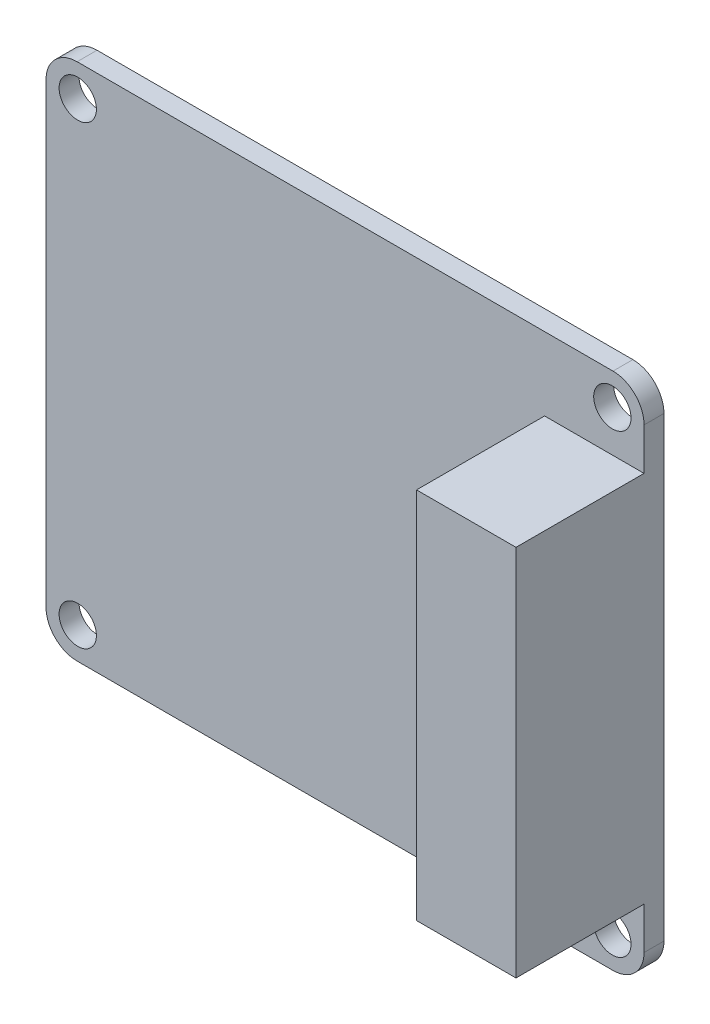
ISO-10303-21;
HEADER;
FILE_DESCRIPTION(('STEP AP214'),'2;1');
FILE_NAME('part.step','',(''),(''),'','','');
FILE_SCHEMA(('AUTOMOTIVE_DESIGN { 1 0 10303 214 1 1 1 1 }'));
ENDSEC;
DATA;
#1=APPLICATION_CONTEXT('core data for automotive mechanical design processes');
#2=APPLICATION_PROTOCOL_DEFINITION('international standard','automotive_design',2000,#1);
#3=PRODUCT_CONTEXT('',#1,'mechanical');
#4=PRODUCT('Part','Part','',(#3));
#5=PRODUCT_RELATED_PRODUCT_CATEGORY('part','',(#4));
#6=PRODUCT_DEFINITION_FORMATION('','',#4);
#7=PRODUCT_DEFINITION_CONTEXT('part definition',#1,'design');
#8=PRODUCT_DEFINITION('design','',#6,#7);
#9=PRODUCT_DEFINITION_SHAPE('','',#8);
#10=(LENGTH_UNIT() NAMED_UNIT(*) SI_UNIT(.MILLI.,.METRE.));
#11=(NAMED_UNIT(*) PLANE_ANGLE_UNIT() SI_UNIT($,.RADIAN.));
#12=(NAMED_UNIT(*) SI_UNIT($,.STERADIAN.) SOLID_ANGLE_UNIT());
#13=UNCERTAINTY_MEASURE_WITH_UNIT(LENGTH_MEASURE(1.E-05),#10,'distance_accuracy_value','');
#14=(GEOMETRIC_REPRESENTATION_CONTEXT(3) GLOBAL_UNCERTAINTY_ASSIGNED_CONTEXT((#13)) GLOBAL_UNIT_ASSIGNED_CONTEXT((#10,
#11,#12)) REPRESENTATION_CONTEXT('',''));
#15=CARTESIAN_POINT('',(0.,0.,0.));
#16=DIRECTION('',(0.,0.,1.));
#17=DIRECTION('',(1.,0.,0.));
#18=AXIS2_PLACEMENT_3D('',#15,#16,#17);
#19=CARTESIAN_POINT('',(0.,0.,1.6));
#20=DIRECTION('',(-1.,0.,0.));
#21=DIRECTION('',(0.,0.,1.));
#22=AXIS2_PLACEMENT_3D('',#19,#20,#21);
#23=PLANE('',#22);
#24=DIRECTION('',(0.,1.,0.));
#25=VECTOR('',#24,1.);
#26=CARTESIAN_POINT('',(0.,0.,0.));
#27=LINE('',#26,#25);
#28=CARTESIAN_POINT('',(0.,2.5,0.));
#29=VERTEX_POINT('',#28);
#30=CARTESIAN_POINT('',(0.,39.25,0.));
#31=VERTEX_POINT('',#30);
#32=EDGE_CURVE('E182',#29,#31,#27,.T.);
#33=ORIENTED_EDGE('',*,*,#32,.T.);
#34=DIRECTION('',(0.,0.,-1.));
#35=VECTOR('',#34,1.);
#36=CARTESIAN_POINT('',(0.,39.25,1.6));
#37=LINE('',#36,#35);
#38=CARTESIAN_POINT('',(0.,39.25,1.6));
#39=VERTEX_POINT('',#38);
#40=EDGE_CURVE('E11',#39,#31,#37,.T.);
#41=ORIENTED_EDGE('',*,*,#40,.F.);
#42=DIRECTION('',(0.,1.,0.));
#43=VECTOR('',#42,1.);
#44=CARTESIAN_POINT('',(0.,0.,1.6));
#45=LINE('',#44,#43);
#46=CARTESIAN_POINT('',(0.,35.875,1.6));
#47=VERTEX_POINT('',#46);
#48=EDGE_CURVE('E114',#47,#39,#45,.T.);
#49=ORIENTED_EDGE('',*,*,#48,.F.);
#50=DIRECTION('',(0.,0.,-1.));
#51=VECTOR('',#50,1.);
#52=CARTESIAN_POINT('',(0.,35.875,11.9));
#53=LINE('',#52,#51);
#54=CARTESIAN_POINT('',(0.,35.875,11.9));
#55=VERTEX_POINT('',#54);
#56=EDGE_CURVE('E284',#55,#47,#53,.T.);
#57=ORIENTED_EDGE('',*,*,#56,.F.);
#58=DIRECTION('',(0.,1.,0.));
#59=VECTOR('',#58,1.);
#60=CARTESIAN_POINT('',(0.,0.,11.9));
#61=LINE('',#60,#59);
#62=CARTESIAN_POINT('',(0.,5.87500000000001,11.9));
#63=VERTEX_POINT('',#62);
#64=EDGE_CURVE('E302',#63,#55,#61,.T.);
#65=ORIENTED_EDGE('',*,*,#64,.F.);
#66=DIRECTION('',(0.,0.,-1.));
#67=VECTOR('',#66,1.);
#68=CARTESIAN_POINT('',(0.,5.87500000000001,11.9));
#69=LINE('',#68,#67);
#70=CARTESIAN_POINT('',(0.,5.87500000000001,1.6));
#71=VERTEX_POINT('',#70);
#72=EDGE_CURVE('E280',#63,#71,#69,.T.);
#73=ORIENTED_EDGE('',*,*,#72,.T.);
#74=CARTESIAN_POINT('',(0.,2.5,1.6));
#75=VERTEX_POINT('',#74);
#76=EDGE_CURVE('E266',#75,#71,#45,.T.);
#77=ORIENTED_EDGE('',*,*,#76,.F.);
#78=DIRECTION('',(0.,0.,-1.));
#79=VECTOR('',#78,1.);
#80=CARTESIAN_POINT('',(0.,2.5,1.6));
#81=LINE('',#80,#79);
#82=EDGE_CURVE('E75',#75,#29,#81,.T.);
#83=ORIENTED_EDGE('',*,*,#82,.T.);
#84=EDGE_LOOP('',(#33,#41,#49,#57,#65,#73,#77,#83));
#85=FACE_BOUND('',#84,.T.);
#86=ADVANCED_FACE('F51',(#85),#23,.F.);
#87=CARTESIAN_POINT('',(-2.5,39.25,1.6));
#88=DIRECTION('',(0.,0.,-1.));
#89=DIRECTION('',(-1.,0.,0.));
#90=AXIS2_PLACEMENT_3D('',#87,#88,#89);
#91=CYLINDRICAL_SURFACE('',#90,2.5);
#92=CARTESIAN_POINT('',(-2.5,39.25,0.));
#93=DIRECTION('',(0.,0.,1.));
#94=DIRECTION('',(1.,0.,0.));
#95=AXIS2_PLACEMENT_3D('',#92,#93,#94);
#96=CIRCLE('',#95,2.5);
#97=CARTESIAN_POINT('',(-2.5,41.75,0.));
#98=VERTEX_POINT('',#97);
#99=EDGE_CURVE('E185',#31,#98,#96,.T.);
#100=ORIENTED_EDGE('',*,*,#99,.T.);
#101=DIRECTION('',(0.,0.,-1.));
#102=VECTOR('',#101,1.);
#103=CARTESIAN_POINT('',(-2.5,41.75,1.6));
#104=LINE('',#103,#102);
#105=CARTESIAN_POINT('',(-2.5,41.75,1.6));
#106=VERTEX_POINT('',#105);
#107=EDGE_CURVE('E59',#106,#98,#104,.T.);
#108=ORIENTED_EDGE('',*,*,#107,.F.);
#109=CARTESIAN_POINT('',(-2.5,39.25,1.6));
#110=DIRECTION('',(0.,0.,1.));
#111=DIRECTION('',(1.,0.,0.));
#112=AXIS2_PLACEMENT_3D('',#109,#110,#111);
#113=CIRCLE('',#112,2.5);
#114=EDGE_CURVE('E261',#39,#106,#113,.T.);
#115=ORIENTED_EDGE('',*,*,#114,.F.);
#116=ORIENTED_EDGE('',*,*,#40,.T.);
#117=EDGE_LOOP('',(#100,#108,#115,#116));
#118=FACE_BOUND('',#117,.T.);
#119=ADVANCED_FACE('F333',(#118),#91,.T.);
#120=CARTESIAN_POINT('',(0.,41.75,1.6));
#121=DIRECTION('',(0.,-1.,0.));
#122=DIRECTION('',(0.,0.,-1.));
#123=AXIS2_PLACEMENT_3D('',#120,#121,#122);
#124=PLANE('',#123);
#125=DIRECTION('',(-1.,0.,0.));
#126=VECTOR('',#125,1.);
#127=CARTESIAN_POINT('',(0.,41.75,0.));
#128=LINE('',#127,#126);
#129=CARTESIAN_POINT('',(-45.6,41.75,0.));
#130=VERTEX_POINT('',#129);
#131=EDGE_CURVE('E189',#98,#130,#128,.T.);
#132=ORIENTED_EDGE('',*,*,#131,.T.);
#133=DIRECTION('',(0.,0.,-1.));
#134=VECTOR('',#133,1.);
#135=CARTESIAN_POINT('',(-45.6,41.75,1.6));
#136=LINE('',#135,#134);
#137=CARTESIAN_POINT('',(-45.6,41.75,1.6));
#138=VERTEX_POINT('',#137);
#139=EDGE_CURVE('E235',#138,#130,#136,.T.);
#140=ORIENTED_EDGE('',*,*,#139,.F.);
#141=DIRECTION('',(-1.,0.,0.));
#142=VECTOR('',#141,1.);
#143=CARTESIAN_POINT('',(0.,41.75,1.6));
#144=LINE('',#143,#142);
#145=EDGE_CURVE('E245',#106,#138,#144,.T.);
#146=ORIENTED_EDGE('',*,*,#145,.F.);
#147=ORIENTED_EDGE('',*,*,#107,.T.);
#148=EDGE_LOOP('',(#132,#140,#146,#147));
#149=FACE_BOUND('',#148,.T.);
#150=ADVANCED_FACE('F243',(#149),#124,.F.);
#151=CARTESIAN_POINT('',(-45.6,39.25,1.6));
#152=DIRECTION('',(0.,0.,-1.));
#153=DIRECTION('',(-1.,0.,0.));
#154=AXIS2_PLACEMENT_3D('',#151,#152,#153);
#155=CYLINDRICAL_SURFACE('',#154,2.5);
#156=CARTESIAN_POINT('',(-45.6,39.25,0.));
#157=DIRECTION('',(0.,0.,1.));
#158=DIRECTION('',(1.,0.,0.));
#159=AXIS2_PLACEMENT_3D('',#156,#157,#158);
#160=CIRCLE('',#159,2.5);
#161=CARTESIAN_POINT('',(-48.1,39.25,0.));
#162=VERTEX_POINT('',#161);
#163=EDGE_CURVE('E193',#162,#130,#160,.F.);
#164=ORIENTED_EDGE('',*,*,#163,.F.);
#165=DIRECTION('',(0.,0.,-1.));
#166=VECTOR('',#165,1.);
#167=CARTESIAN_POINT('',(-48.1,39.25,1.6));
#168=LINE('',#167,#166);
#169=CARTESIAN_POINT('',(-48.1,39.25,1.6));
#170=VERTEX_POINT('',#169);
#171=EDGE_CURVE('E232',#170,#162,#168,.T.);
#172=ORIENTED_EDGE('',*,*,#171,.F.);
#173=CARTESIAN_POINT('',(-45.6,39.25,1.6));
#174=DIRECTION('',(0.,0.,1.));
#175=DIRECTION('',(1.,0.,0.));
#176=AXIS2_PLACEMENT_3D('',#173,#174,#175);
#177=CIRCLE('',#176,2.5);
#178=EDGE_CURVE('E256',#170,#138,#177,.F.);
#179=ORIENTED_EDGE('',*,*,#178,.T.);
#180=ORIENTED_EDGE('',*,*,#139,.T.);
#181=EDGE_LOOP('',(#164,#172,#179,#180));
#182=FACE_BOUND('',#181,.T.);
#183=ADVANCED_FACE('F254',(#182),#155,.T.);
#184=CARTESIAN_POINT('',(-48.1,0.,1.6));
#185=DIRECTION('',(-1.,0.,0.));
#186=DIRECTION('',(0.,0.,1.));
#187=AXIS2_PLACEMENT_3D('',#184,#185,#186);
#188=PLANE('',#187);
#189=DIRECTION('',(0.,1.,0.));
#190=VECTOR('',#189,1.);
#191=CARTESIAN_POINT('',(-48.1,0.,0.));
#192=LINE('',#191,#190);
#193=CARTESIAN_POINT('',(-48.1,2.5,0.));
#194=VERTEX_POINT('',#193);
#195=EDGE_CURVE('E197',#194,#162,#192,.T.);
#196=ORIENTED_EDGE('',*,*,#195,.F.);
#197=DIRECTION('',(0.,0.,-1.));
#198=VECTOR('',#197,1.);
#199=CARTESIAN_POINT('',(-48.1,2.5,1.6));
#200=LINE('',#199,#198);
#201=CARTESIAN_POINT('',(-48.1,2.5,1.6));
#202=VERTEX_POINT('',#201);
#203=EDGE_CURVE('E143',#202,#194,#200,.T.);
#204=ORIENTED_EDGE('',*,*,#203,.F.);
#205=DIRECTION('',(0.,1.,0.));
#206=VECTOR('',#205,1.);
#207=CARTESIAN_POINT('',(-48.1,0.,1.6));
#208=LINE('',#207,#206);
#209=EDGE_CURVE('E155',#202,#170,#208,.T.);
#210=ORIENTED_EDGE('',*,*,#209,.T.);
#211=ORIENTED_EDGE('',*,*,#171,.T.);
#212=EDGE_LOOP('',(#196,#204,#210,#211));
#213=FACE_BOUND('',#212,.T.);
#214=ADVANCED_FACE('F343',(#213),#188,.T.);
#215=CARTESIAN_POINT('',(-45.6,2.5,1.6));
#216=DIRECTION('',(0.,0.,-1.));
#217=DIRECTION('',(-1.,0.,0.));
#218=AXIS2_PLACEMENT_3D('',#215,#216,#217);
#219=CYLINDRICAL_SURFACE('',#218,2.5);
#220=CARTESIAN_POINT('',(-45.6,2.5,0.));
#221=DIRECTION('',(0.,0.,1.));
#222=DIRECTION('',(1.,0.,0.));
#223=AXIS2_PLACEMENT_3D('',#220,#221,#222);
#224=CIRCLE('',#223,2.5);
#225=CARTESIAN_POINT('',(-45.6,0.,0.));
#226=VERTEX_POINT('',#225);
#227=EDGE_CURVE('E137',#226,#194,#224,.F.);
#228=ORIENTED_EDGE('',*,*,#227,.F.);
#229=DIRECTION('',(0.,0.,-1.));
#230=VECTOR('',#229,1.);
#231=CARTESIAN_POINT('',(-45.6,0.,1.6));
#232=LINE('',#231,#230);
#233=CARTESIAN_POINT('',(-45.6,0.,1.6));
#234=VERTEX_POINT('',#233);
#235=EDGE_CURVE('E132',#234,#226,#232,.T.);
#236=ORIENTED_EDGE('',*,*,#235,.F.);
#237=CARTESIAN_POINT('',(-45.6,2.5,1.6));
#238=DIRECTION('',(0.,0.,1.));
#239=DIRECTION('',(1.,0.,0.));
#240=AXIS2_PLACEMENT_3D('',#237,#238,#239);
#241=CIRCLE('',#240,2.5);
#242=EDGE_CURVE('E135',#234,#202,#241,.F.);
#243=ORIENTED_EDGE('',*,*,#242,.T.);
#244=ORIENTED_EDGE('',*,*,#203,.T.);
#245=EDGE_LOOP('',(#228,#236,#243,#244));
#246=FACE_BOUND('',#245,.T.);
#247=ADVANCED_FACE('F134',(#246),#219,.T.);
#248=CARTESIAN_POINT('',(0.,0.,1.6));
#249=DIRECTION('',(0.,-1.,0.));
#250=DIRECTION('',(0.,0.,-1.));
#251=AXIS2_PLACEMENT_3D('',#248,#249,#250);
#252=PLANE('',#251);
#253=DIRECTION('',(-1.,0.,0.));
#254=VECTOR('',#253,1.);
#255=CARTESIAN_POINT('',(0.,0.,0.));
#256=LINE('',#255,#254);
#257=CARTESIAN_POINT('',(-2.5,0.,0.));
#258=VERTEX_POINT('',#257);
#259=EDGE_CURVE('E203',#258,#226,#256,.T.);
#260=ORIENTED_EDGE('',*,*,#259,.F.);
#261=DIRECTION('',(0.,0.,-1.));
#262=VECTOR('',#261,1.);
#263=CARTESIAN_POINT('',(-2.5,0.,1.6));
#264=LINE('',#263,#262);
#265=CARTESIAN_POINT('',(-2.5,0.,1.6));
#266=VERTEX_POINT('',#265);
#267=EDGE_CURVE('E144',#266,#258,#264,.T.);
#268=ORIENTED_EDGE('',*,*,#267,.F.);
#269=DIRECTION('',(-1.,0.,0.));
#270=VECTOR('',#269,1.);
#271=CARTESIAN_POINT('',(0.,0.,1.6));
#272=LINE('',#271,#270);
#273=EDGE_CURVE('E152',#266,#234,#272,.T.);
#274=ORIENTED_EDGE('',*,*,#273,.T.);
#275=ORIENTED_EDGE('',*,*,#235,.T.);
#276=EDGE_LOOP('',(#260,#268,#274,#275));
#277=FACE_BOUND('',#276,.T.);
#278=ADVANCED_FACE('F158',(#277),#252,.T.);
#279=CARTESIAN_POINT('',(-45.5500863149416,39.2000863149416,1.6));
#280=DIRECTION('',(0.,0.,-1.));
#281=DIRECTION('',(-1.,0.,0.));
#282=AXIS2_PLACEMENT_3D('',#279,#280,#281);
#283=CYLINDRICAL_SURFACE('',#282,1.5);
#284=CARTESIAN_POINT('',(-45.5500863149416,39.2000863149416,1.6));
#285=DIRECTION('',(0.,0.,1.));
#286=DIRECTION('',(1.,0.,0.));
#287=AXIS2_PLACEMENT_3D('',#284,#285,#286);
#288=CIRCLE('',#287,1.5);
#289=CARTESIAN_POINT('',(-44.0500863149416,39.2000863149416,1.6));
#290=VERTEX_POINT('',#289);
#291=EDGE_CURVE('E174',#290,#290,#288,.T.);
#292=ORIENTED_EDGE('',*,*,#291,.T.);
#293=EDGE_LOOP('',(#292));
#294=FACE_BOUND('',#293,.T.);
#295=CARTESIAN_POINT('',(-45.5500863149416,39.2000863149416,0.));
#296=DIRECTION('',(0.,0.,1.));
#297=DIRECTION('',(1.,0.,0.));
#298=AXIS2_PLACEMENT_3D('',#295,#296,#297);
#299=CIRCLE('',#298,1.5);
#300=CARTESIAN_POINT('',(-44.0500863149416,39.2000863149416,0.));
#301=VERTEX_POINT('',#300);
#302=EDGE_CURVE('E218',#301,#301,#299,.T.);
#303=ORIENTED_EDGE('',*,*,#302,.F.);
#304=EDGE_LOOP('',(#303));
#305=FACE_BOUND('',#304,.T.);
#306=ADVANCED_FACE('F351',(#294,#305),#283,.F.);
#307=CARTESIAN_POINT('',(-45.5500863149416,2.54991368505839,1.6));
#308=DIRECTION('',(0.,0.,-1.));
#309=DIRECTION('',(-1.,0.,0.));
#310=AXIS2_PLACEMENT_3D('',#307,#308,#309);
#311=CYLINDRICAL_SURFACE('',#310,1.5);
#312=CARTESIAN_POINT('',(-45.5500863149416,2.54991368505839,1.6));
#313=DIRECTION('',(0.,0.,1.));
#314=DIRECTION('',(1.,0.,0.));
#315=AXIS2_PLACEMENT_3D('',#312,#313,#314);
#316=CIRCLE('',#315,1.5);
#317=CARTESIAN_POINT('',(-44.0500863149416,2.54991368505839,1.6));
#318=VERTEX_POINT('',#317);
#319=EDGE_CURVE('E170',#318,#318,#316,.T.);
#320=ORIENTED_EDGE('',*,*,#319,.T.);
#321=EDGE_LOOP('',(#320));
#322=FACE_BOUND('',#321,.T.);
#323=CARTESIAN_POINT('',(-45.5500863149416,2.54991368505839,0.));
#324=DIRECTION('',(0.,0.,1.));
#325=DIRECTION('',(1.,0.,0.));
#326=AXIS2_PLACEMENT_3D('',#323,#324,#325);
#327=CIRCLE('',#326,1.5);
#328=CARTESIAN_POINT('',(-44.0500863149416,2.54991368505839,0.));
#329=VERTEX_POINT('',#328);
#330=EDGE_CURVE('E214',#329,#329,#327,.T.);
#331=ORIENTED_EDGE('',*,*,#330,.F.);
#332=EDGE_LOOP('',(#331));
#333=FACE_BOUND('',#332,.T.);
#334=ADVANCED_FACE('F358',(#322,#333),#311,.F.);
#335=CARTESIAN_POINT('',(-2.54991368505839,39.2000863149416,1.6));
#336=DIRECTION('',(0.,0.,-1.));
#337=DIRECTION('',(-1.,0.,0.));
#338=AXIS2_PLACEMENT_3D('',#335,#336,#337);
#339=CYLINDRICAL_SURFACE('',#338,1.5);
#340=CARTESIAN_POINT('',(-2.54991368505839,39.2000863149416,1.6));
#341=DIRECTION('',(0.,0.,1.));
#342=DIRECTION('',(1.,0.,0.));
#343=AXIS2_PLACEMENT_3D('',#340,#341,#342);
#344=CIRCLE('',#343,1.5);
#345=CARTESIAN_POINT('',(-1.04991368505838,39.2000863149416,1.6));
#346=VERTEX_POINT('',#345);
#347=EDGE_CURVE('E163',#346,#346,#344,.T.);
#348=ORIENTED_EDGE('',*,*,#347,.T.);
#349=EDGE_LOOP('',(#348));
#350=FACE_BOUND('',#349,.T.);
#351=CARTESIAN_POINT('',(-2.54991368505839,39.2000863149416,0.));
#352=DIRECTION('',(0.,0.,1.));
#353=DIRECTION('',(1.,0.,0.));
#354=AXIS2_PLACEMENT_3D('',#351,#352,#353);
#355=CIRCLE('',#354,1.5);
#356=CARTESIAN_POINT('',(-1.04991368505838,39.2000863149416,0.));
#357=VERTEX_POINT('',#356);
#358=EDGE_CURVE('E210',#357,#357,#355,.T.);
#359=ORIENTED_EDGE('',*,*,#358,.F.);
#360=EDGE_LOOP('',(#359));
#361=FACE_BOUND('',#360,.T.);
#362=ADVANCED_FACE('F355',(#350,#361),#339,.F.);
#363=CARTESIAN_POINT('',(-2.5,2.5,1.6));
#364=DIRECTION('',(0.,0.,-1.));
#365=DIRECTION('',(-1.,0.,0.));
#366=AXIS2_PLACEMENT_3D('',#363,#364,#365);
#367=CYLINDRICAL_SURFACE('',#366,2.5);
#368=CARTESIAN_POINT('',(-2.5,2.5,0.));
#369=DIRECTION('',(0.,0.,1.));
#370=DIRECTION('',(1.,0.,0.));
#371=AXIS2_PLACEMENT_3D('',#368,#369,#370);
#372=CIRCLE('',#371,2.5);
#373=EDGE_CURVE('E206',#29,#258,#372,.F.);
#374=ORIENTED_EDGE('',*,*,#373,.F.);
#375=ORIENTED_EDGE('',*,*,#82,.F.);
#376=CARTESIAN_POINT('',(-2.5,2.5,1.6));
#377=DIRECTION('',(0.,0.,1.));
#378=DIRECTION('',(1.,0.,0.));
#379=AXIS2_PLACEMENT_3D('',#376,#377,#378);
#380=CIRCLE('',#379,2.5);
#381=EDGE_CURVE('E160',#75,#266,#380,.F.);
#382=ORIENTED_EDGE('',*,*,#381,.T.);
#383=ORIENTED_EDGE('',*,*,#267,.T.);
#384=EDGE_LOOP('',(#374,#375,#382,#383));
#385=FACE_BOUND('',#384,.T.);
#386=ADVANCED_FACE('F331',(#385),#367,.T.);
#387=CARTESIAN_POINT('',(-2.54991368505839,2.54991368505839,1.6));
#388=DIRECTION('',(0.,0.,-1.));
#389=DIRECTION('',(-1.,0.,0.));
#390=AXIS2_PLACEMENT_3D('',#387,#388,#389);
#391=CYLINDRICAL_SURFACE('',#390,1.5);
#392=CARTESIAN_POINT('',(-2.54991368505839,2.54991368505839,1.6));
#393=DIRECTION('',(0.,0.,1.));
#394=DIRECTION('',(1.,0.,0.));
#395=AXIS2_PLACEMENT_3D('',#392,#393,#394);
#396=CIRCLE('',#395,1.5);
#397=CARTESIAN_POINT('',(-1.04991368505838,2.54991368505839,1.6));
#398=VERTEX_POINT('',#397);
#399=EDGE_CURVE('E178',#398,#398,#396,.T.);
#400=ORIENTED_EDGE('',*,*,#399,.T.);
#401=EDGE_LOOP('',(#400));
#402=FACE_BOUND('',#401,.T.);
#403=CARTESIAN_POINT('',(-2.54991368505839,2.54991368505839,0.));
#404=DIRECTION('',(0.,0.,1.));
#405=DIRECTION('',(1.,0.,0.));
#406=AXIS2_PLACEMENT_3D('',#403,#404,#405);
#407=CIRCLE('',#406,1.5);
#408=CARTESIAN_POINT('',(-1.04991368505838,2.54991368505839,0.));
#409=VERTEX_POINT('',#408);
#410=EDGE_CURVE('E222',#409,#409,#407,.T.);
#411=ORIENTED_EDGE('',*,*,#410,.F.);
#412=EDGE_LOOP('',(#411));
#413=FACE_BOUND('',#412,.T.);
#414=ADVANCED_FACE('F354',(#402,#413),#391,.F.);
#415=CARTESIAN_POINT('',(0.,0.,1.6));
#416=DIRECTION('',(0.,0.,1.));
#417=DIRECTION('',(1.,0.,0.));
#418=AXIS2_PLACEMENT_3D('',#415,#416,#417);
#419=PLANE('',#418);
#420=DIRECTION('',(1.,0.,0.));
#421=VECTOR('',#420,1.);
#422=CARTESIAN_POINT('',(0.,5.87500000000001,1.6));
#423=LINE('',#422,#421);
#424=CARTESIAN_POINT('',(-8.,5.875,1.6));
#425=VERTEX_POINT('',#424);
#426=EDGE_CURVE('E186',#425,#71,#423,.T.);
#427=ORIENTED_EDGE('',*,*,#426,.F.);
#428=DIRECTION('',(0.,1.,0.));
#429=VECTOR('',#428,1.);
#430=CARTESIAN_POINT('',(-8.,0.,1.6));
#431=LINE('',#430,#429);
#432=CARTESIAN_POINT('',(-8.,35.875,1.6));
#433=VERTEX_POINT('',#432);
#434=EDGE_CURVE('E276',#425,#433,#431,.T.);
#435=ORIENTED_EDGE('',*,*,#434,.T.);
#436=DIRECTION('',(1.,0.,0.));
#437=VECTOR('',#436,1.);
#438=CARTESIAN_POINT('',(0.,35.875,1.6));
#439=LINE('',#438,#437);
#440=EDGE_CURVE('E273',#433,#47,#439,.T.);
#441=ORIENTED_EDGE('',*,*,#440,.T.);
#442=ORIENTED_EDGE('',*,*,#48,.T.);
#443=ORIENTED_EDGE('',*,*,#114,.T.);
#444=ORIENTED_EDGE('',*,*,#145,.T.);
#445=ORIENTED_EDGE('',*,*,#178,.F.);
#446=ORIENTED_EDGE('',*,*,#209,.F.);
#447=ORIENTED_EDGE('',*,*,#242,.F.);
#448=ORIENTED_EDGE('',*,*,#273,.F.);
#449=ORIENTED_EDGE('',*,*,#381,.F.);
#450=ORIENTED_EDGE('',*,*,#76,.T.);
#451=EDGE_LOOP('',(#427,#435,#441,#442,#443,#444,#445,#446,#447,#448,#449,#450));
#452=FACE_BOUND('',#451,.T.);
#453=ORIENTED_EDGE('',*,*,#347,.F.);
#454=EDGE_LOOP('',(#453));
#455=FACE_BOUND('',#454,.T.);
#456=ORIENTED_EDGE('',*,*,#319,.F.);
#457=EDGE_LOOP('',(#456));
#458=FACE_BOUND('',#457,.T.);
#459=ORIENTED_EDGE('',*,*,#291,.F.);
#460=EDGE_LOOP('',(#459));
#461=FACE_BOUND('',#460,.T.);
#462=ORIENTED_EDGE('',*,*,#399,.F.);
#463=EDGE_LOOP('',(#462));
#464=FACE_BOUND('',#463,.T.);
#465=ADVANCED_FACE('F149',(#452,#455,#458,#461,#464),#419,.T.);
#466=CARTESIAN_POINT('',(0.,0.,0.));
#467=DIRECTION('',(0.,0.,1.));
#468=DIRECTION('',(1.,0.,0.));
#469=AXIS2_PLACEMENT_3D('',#466,#467,#468);
#470=PLANE('',#469);
#471=ORIENTED_EDGE('',*,*,#99,.F.);
#472=ORIENTED_EDGE('',*,*,#32,.F.);
#473=ORIENTED_EDGE('',*,*,#373,.T.);
#474=ORIENTED_EDGE('',*,*,#259,.T.);
#475=ORIENTED_EDGE('',*,*,#227,.T.);
#476=ORIENTED_EDGE('',*,*,#195,.T.);
#477=ORIENTED_EDGE('',*,*,#163,.T.);
#478=ORIENTED_EDGE('',*,*,#131,.F.);
#479=EDGE_LOOP('',(#471,#472,#473,#474,#475,#476,#477,#478));
#480=FACE_BOUND('',#479,.T.);
#481=ORIENTED_EDGE('',*,*,#358,.T.);
#482=EDGE_LOOP('',(#481));
#483=FACE_BOUND('',#482,.T.);
#484=ORIENTED_EDGE('',*,*,#330,.T.);
#485=EDGE_LOOP('',(#484));
#486=FACE_BOUND('',#485,.T.);
#487=ORIENTED_EDGE('',*,*,#302,.T.);
#488=EDGE_LOOP('',(#487));
#489=FACE_BOUND('',#488,.T.);
#490=ORIENTED_EDGE('',*,*,#410,.T.);
#491=EDGE_LOOP('',(#490));
#492=FACE_BOUND('',#491,.T.);
#493=ADVANCED_FACE('F249',(#480,#483,#486,#489,#492),#470,.F.);
#494=CARTESIAN_POINT('',(0.,5.87500000000001,11.9));
#495=DIRECTION('',(0.,-1.,0.));
#496=DIRECTION('',(1.,0.,0.));
#497=AXIS2_PLACEMENT_3D('',#494,#495,#496);
#498=PLANE('',#497);
#499=DIRECTION('',(0.,0.,-1.));
#500=VECTOR('',#499,1.);
#501=CARTESIAN_POINT('',(-8.,5.875,11.9));
#502=LINE('',#501,#500);
#503=CARTESIAN_POINT('',(-8.,5.875,11.9));
#504=VERTEX_POINT('',#503);
#505=EDGE_CURVE('E290',#504,#425,#502,.T.);
#506=ORIENTED_EDGE('',*,*,#505,.T.);
#507=ORIENTED_EDGE('',*,*,#426,.T.);
#508=ORIENTED_EDGE('',*,*,#72,.F.);
#509=DIRECTION('',(-1.,0.,0.));
#510=VECTOR('',#509,1.);
#511=CARTESIAN_POINT('',(0.,5.87500000000001,11.9));
#512=LINE('',#511,#510);
#513=EDGE_CURVE('E306',#63,#504,#512,.T.);
#514=ORIENTED_EDGE('',*,*,#513,.T.);
#515=EDGE_LOOP('',(#506,#507,#508,#514));
#516=FACE_BOUND('',#515,.T.);
#517=ADVANCED_FACE('F313',(#516),#498,.T.);
#518=CARTESIAN_POINT('',(0.,35.875,11.9));
#519=DIRECTION('',(0.,-1.,0.));
#520=DIRECTION('',(0.,0.,-1.));
#521=AXIS2_PLACEMENT_3D('',#518,#519,#520);
#522=PLANE('',#521);
#523=ORIENTED_EDGE('',*,*,#440,.F.);
#524=DIRECTION('',(0.,0.,-1.));
#525=VECTOR('',#524,1.);
#526=CARTESIAN_POINT('',(-8.,35.875,11.9));
#527=LINE('',#526,#525);
#528=CARTESIAN_POINT('',(-8.,35.875,11.9));
#529=VERTEX_POINT('',#528);
#530=EDGE_CURVE('E66',#529,#433,#527,.T.);
#531=ORIENTED_EDGE('',*,*,#530,.F.);
#532=DIRECTION('',(-1.,0.,0.));
#533=VECTOR('',#532,1.);
#534=CARTESIAN_POINT('',(0.,35.875,11.9));
#535=LINE('',#534,#533);
#536=EDGE_CURVE('E298',#55,#529,#535,.T.);
#537=ORIENTED_EDGE('',*,*,#536,.F.);
#538=ORIENTED_EDGE('',*,*,#56,.T.);
#539=EDGE_LOOP('',(#523,#531,#537,#538));
#540=FACE_BOUND('',#539,.T.);
#541=ADVANCED_FACE('F375',(#540),#522,.F.);
#542=CARTESIAN_POINT('',(-8.,0.,11.9));
#543=DIRECTION('',(1.,0.,0.));
#544=DIRECTION('',(0.,1.,0.));
#545=AXIS2_PLACEMENT_3D('',#542,#543,#544);
#546=PLANE('',#545);
#547=ORIENTED_EDGE('',*,*,#434,.F.);
#548=ORIENTED_EDGE('',*,*,#505,.F.);
#549=DIRECTION('',(0.,-1.,0.));
#550=VECTOR('',#549,1.);
#551=CARTESIAN_POINT('',(-8.,0.,11.9));
#552=LINE('',#551,#550);
#553=EDGE_CURVE('E294',#529,#504,#552,.T.);
#554=ORIENTED_EDGE('',*,*,#553,.F.);
#555=ORIENTED_EDGE('',*,*,#530,.T.);
#556=EDGE_LOOP('',(#547,#548,#554,#555));
#557=FACE_BOUND('',#556,.T.);
#558=ADVANCED_FACE('F378',(#557),#546,.F.);
#559=CARTESIAN_POINT('',(0.,0.,11.9));
#560=DIRECTION('',(0.,0.,1.));
#561=DIRECTION('',(1.,0.,0.));
#562=AXIS2_PLACEMENT_3D('',#559,#560,#561);
#563=PLANE('',#562);
#564=ORIENTED_EDGE('',*,*,#513,.F.);
#565=ORIENTED_EDGE('',*,*,#64,.T.);
#566=ORIENTED_EDGE('',*,*,#536,.T.);
#567=ORIENTED_EDGE('',*,*,#553,.T.);
#568=EDGE_LOOP('',(#564,#565,#566,#567));
#569=FACE_BOUND('',#568,.T.);
#570=ADVANCED_FACE('F321',(#569),#563,.T.);
#571=CLOSED_SHELL('',(#86,#119,#150,#183,#214,#247,#278,#306,#334,#362,#386,#414,#465,#493,#517,
#541,#558,#570));
#572=MANIFOLD_SOLID_BREP('B2',#571);
#573=ADVANCED_BREP_SHAPE_REPRESENTATION('',(#18,#572),#14);
#574=SHAPE_DEFINITION_REPRESENTATION(#9,#573);
ENDSEC;
END-ISO-10303-21;
